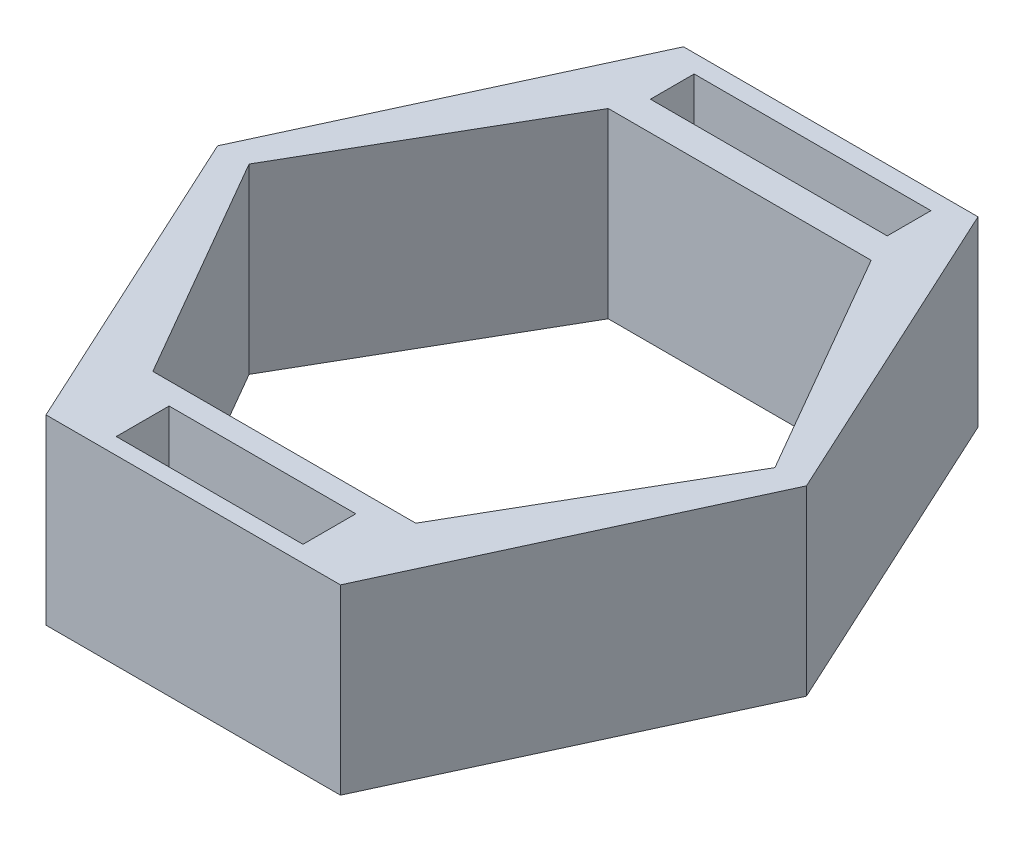
ISO-10303-21;
HEADER;
FILE_DESCRIPTION(('STEP AP214'),'2;1');
FILE_NAME('part.step','',(''),(''),'','','');
FILE_SCHEMA(('AUTOMOTIVE_DESIGN { 1 0 10303 214 1 1 1 1 }'));
ENDSEC;
DATA;
#1=APPLICATION_CONTEXT('core data for automotive mechanical design processes');
#2=APPLICATION_PROTOCOL_DEFINITION('international standard','automotive_design',2000,#1);
#3=PRODUCT_CONTEXT('',#1,'mechanical');
#4=PRODUCT('Part','Part','',(#3));
#5=PRODUCT_RELATED_PRODUCT_CATEGORY('part','',(#4));
#6=PRODUCT_DEFINITION_FORMATION('','',#4);
#7=PRODUCT_DEFINITION_CONTEXT('part definition',#1,'design');
#8=PRODUCT_DEFINITION('design','',#6,#7);
#9=PRODUCT_DEFINITION_SHAPE('','',#8);
#10=(LENGTH_UNIT() NAMED_UNIT(*) SI_UNIT(.MILLI.,.METRE.));
#11=(NAMED_UNIT(*) PLANE_ANGLE_UNIT() SI_UNIT($,.RADIAN.));
#12=(NAMED_UNIT(*) SI_UNIT($,.STERADIAN.) SOLID_ANGLE_UNIT());
#13=UNCERTAINTY_MEASURE_WITH_UNIT(LENGTH_MEASURE(1.E-05),#10,'distance_accuracy_value','');
#14=(GEOMETRIC_REPRESENTATION_CONTEXT(3) GLOBAL_UNCERTAINTY_ASSIGNED_CONTEXT((#13)) GLOBAL_UNIT_ASSIGNED_CONTEXT((#10,
#11,#12)) REPRESENTATION_CONTEXT('',''));
#15=CARTESIAN_POINT('',(0.,0.,0.));
#16=DIRECTION('',(0.,0.,1.));
#17=DIRECTION('',(1.,0.,0.));
#18=AXIS2_PLACEMENT_3D('',#15,#16,#17);
#19=CARTESIAN_POINT('',(0.,20.,0.));
#20=DIRECTION('',(0.,1.,0.));
#21=DIRECTION('',(0.,0.,1.));
#22=AXIS2_PLACEMENT_3D('',#19,#20,#21);
#23=PLANE('',#22);
#24=DIRECTION('',(1.,0.,0.));
#25=VECTOR('',#24,1.);
#26=CARTESIAN_POINT('',(0.,20.,35.));
#27=LINE('',#26,#25);
#28=CARTESIAN_POINT('',(-16.1658075373095,20.,35.));
#29=VERTEX_POINT('',#28);
#30=CARTESIAN_POINT('',(16.1658075373095,20.,35.));
#31=VERTEX_POINT('',#30);
#32=EDGE_CURVE('E237',#29,#31,#27,.T.);
#33=ORIENTED_EDGE('',*,*,#32,.T.);
#34=DIRECTION('',(0.419313934688772,0.,-0.907841299003201));
#35=VECTOR('',#34,1.);
#36=CARTESIAN_POINT('',(26.6469355010597,20.,12.3076923076925));
#37=LINE('',#36,#35);
#38=CARTESIAN_POINT('',(32.3316150746192,20.,1.66533453693773E-13));
#39=VERTEX_POINT('',#38);
#40=EDGE_CURVE('E240',#31,#39,#37,.T.);
#41=ORIENTED_EDGE('',*,*,#40,.T.);
#42=DIRECTION('',(0.419313934688769,0.,0.907841299003203));
#43=VECTOR('',#42,1.);
#44=CARTESIAN_POINT('',(26.6469355010596,20.,-12.3076923076924));
#45=LINE('',#44,#43);
#46=CARTESIAN_POINT('',(16.1658075373095,20.,-35.));
#47=VERTEX_POINT('',#46);
#48=EDGE_CURVE('E243',#47,#39,#45,.T.);
#49=ORIENTED_EDGE('',*,*,#48,.F.);
#50=DIRECTION('',(1.,0.,0.));
#51=VECTOR('',#50,1.);
#52=CARTESIAN_POINT('',(0.,20.,-35.));
#53=LINE('',#52,#51);
#54=CARTESIAN_POINT('',(-16.1658075373095,20.,-35.));
#55=VERTEX_POINT('',#54);
#56=EDGE_CURVE('E246',#55,#47,#53,.T.);
#57=ORIENTED_EDGE('',*,*,#56,.F.);
#58=DIRECTION('',(-0.41931393468877,0.,0.907841299003202));
#59=VECTOR('',#58,1.);
#60=CARTESIAN_POINT('',(-26.6469355010596,20.,-12.3076923076924));
#61=LINE('',#60,#59);
#62=CARTESIAN_POINT('',(-32.3316150746192,20.,0.));
#63=VERTEX_POINT('',#62);
#64=EDGE_CURVE('E249',#55,#63,#61,.T.);
#65=ORIENTED_EDGE('',*,*,#64,.T.);
#66=DIRECTION('',(-0.419313934688771,0.,-0.907841299003202));
#67=VECTOR('',#66,1.);
#68=CARTESIAN_POINT('',(-26.6469355010596,20.,12.3076923076924));
#69=LINE('',#68,#67);
#70=EDGE_CURVE('E251',#29,#63,#69,.T.);
#71=ORIENTED_EDGE('',*,*,#70,.F.);
#72=EDGE_LOOP('',(#33,#41,#49,#57,#65,#71));
#73=FACE_BOUND('',#72,.T.);
#74=DIRECTION('',(0.499999999999995,0.,-0.866025403784441));
#75=VECTOR('',#74,1.);
#76=CARTESIAN_POINT('',(21.6506350946111,20.,12.4999999999999));
#77=LINE('',#76,#75);
#78=CARTESIAN_POINT('',(14.4337567297409,20.,24.9999999999999));
#79=VERTEX_POINT('',#78);
#80=CARTESIAN_POINT('',(28.8675134594813,20.,0.));
#81=VERTEX_POINT('',#80);
#82=EDGE_CURVE('E254',#79,#81,#77,.T.);
#83=ORIENTED_EDGE('',*,*,#82,.F.);
#84=DIRECTION('',(1.,0.,0.));
#85=VECTOR('',#84,1.);
#86=CARTESIAN_POINT('',(2.61402740180265E-13,20.,25.));
#87=LINE('',#86,#85);
#88=CARTESIAN_POINT('',(-14.4337567297404,20.,25.0000000000002));
#89=VERTEX_POINT('',#88);
#90=EDGE_CURVE('E257',#89,#79,#87,.T.);
#91=ORIENTED_EDGE('',*,*,#90,.F.);
#92=DIRECTION('',(0.500000000000007,0.,0.866025403784435));
#93=VECTOR('',#92,1.);
#94=CARTESIAN_POINT('',(-21.6506350946109,20.,12.5000000000002));
#95=LINE('',#94,#93);
#96=CARTESIAN_POINT('',(-28.8675134594813,20.,2.0122792321331E-13));
#97=VERTEX_POINT('',#96);
#98=EDGE_CURVE('E260',#97,#89,#95,.T.);
#99=ORIENTED_EDGE('',*,*,#98,.F.);
#100=DIRECTION('',(-0.499999999999995,0.,0.866025403784442));
#101=VECTOR('',#100,1.);
#102=CARTESIAN_POINT('',(-21.650635094611,20.,-12.4999999999999));
#103=LINE('',#102,#101);
#104=CARTESIAN_POINT('',(-14.4337567297408,20.,-25.));
#105=VERTEX_POINT('',#104);
#106=EDGE_CURVE('E263',#105,#97,#103,.T.);
#107=ORIENTED_EDGE('',*,*,#106,.F.);
#108=DIRECTION('',(-1.,0.,0.));
#109=VECTOR('',#108,1.);
#110=CARTESIAN_POINT('',(0.,20.,-25.));
#111=LINE('',#110,#109);
#112=CARTESIAN_POINT('',(14.4337567297406,20.,-25.));
#113=VERTEX_POINT('',#112);
#114=EDGE_CURVE('E266',#113,#105,#111,.T.);
#115=ORIENTED_EDGE('',*,*,#114,.F.);
#116=DIRECTION('',(-0.500000000000001,0.,-0.866025403784438));
#117=VECTOR('',#116,1.);
#118=CARTESIAN_POINT('',(21.650635094611,20.,-12.5));
#119=LINE('',#118,#117);
#120=EDGE_CURVE('E269',#81,#113,#119,.T.);
#121=ORIENTED_EDGE('',*,*,#120,.F.);
#122=EDGE_LOOP('',(#83,#91,#99,#107,#115,#121));
#123=FACE_BOUND('',#122,.T.);
#124=DIRECTION('',(1.,0.,0.));
#125=VECTOR('',#124,1.);
#126=CARTESIAN_POINT('',(0.,20.,27.4000000000002));
#127=LINE('',#126,#125);
#128=CARTESIAN_POINT('',(-10.25,20.,27.4000000000002));
#129=VERTEX_POINT('',#128);
#130=CARTESIAN_POINT('',(10.25,20.,27.4000000000002));
#131=VERTEX_POINT('',#130);
#132=EDGE_CURVE('E220',#129,#131,#127,.T.);
#133=ORIENTED_EDGE('',*,*,#132,.T.);
#134=DIRECTION('',(0.,0.,1.));
#135=VECTOR('',#134,1.);
#136=CARTESIAN_POINT('',(10.25,20.,0.));
#137=LINE('',#136,#135);
#138=CARTESIAN_POINT('',(10.25,20.,33.2000000000002));
#139=VERTEX_POINT('',#138);
#140=EDGE_CURVE('E203',#131,#139,#137,.T.);
#141=ORIENTED_EDGE('',*,*,#140,.T.);
#142=DIRECTION('',(1.,0.,0.));
#143=VECTOR('',#142,1.);
#144=CARTESIAN_POINT('',(0.,20.,33.2000000000001));
#145=LINE('',#144,#143);
#146=CARTESIAN_POINT('',(-10.25,20.,33.2000000000001));
#147=VERTEX_POINT('',#146);
#148=EDGE_CURVE('E209',#147,#139,#145,.T.);
#149=ORIENTED_EDGE('',*,*,#148,.F.);
#150=DIRECTION('',(0.,0.,1.));
#151=VECTOR('',#150,1.);
#152=CARTESIAN_POINT('',(-10.25,20.,0.));
#153=LINE('',#152,#151);
#154=EDGE_CURVE('E223',#129,#147,#153,.T.);
#155=ORIENTED_EDGE('',*,*,#154,.F.);
#156=EDGE_LOOP('',(#133,#141,#149,#155));
#157=FACE_BOUND('',#156,.T.);
#158=DIRECTION('',(1.,0.,0.));
#159=VECTOR('',#158,1.);
#160=CARTESIAN_POINT('',(0.,20.,-33.));
#161=LINE('',#160,#159);
#162=CARTESIAN_POINT('',(-13.,20.,-33.));
#163=VERTEX_POINT('',#162);
#164=CARTESIAN_POINT('',(13.,20.,-33.));
#165=VERTEX_POINT('',#164);
#166=EDGE_CURVE('E191',#163,#165,#161,.T.);
#167=ORIENTED_EDGE('',*,*,#166,.T.);
#168=DIRECTION('',(0.,0.,1.));
#169=VECTOR('',#168,1.);
#170=CARTESIAN_POINT('',(13.,20.,0.));
#171=LINE('',#170,#169);
#172=CARTESIAN_POINT('',(13.,20.,-28.2));
#173=VERTEX_POINT('',#172);
#174=EDGE_CURVE('E58',#165,#173,#171,.T.);
#175=ORIENTED_EDGE('',*,*,#174,.T.);
#176=DIRECTION('',(1.,0.,0.));
#177=VECTOR('',#176,1.);
#178=CARTESIAN_POINT('',(0.,20.,-28.2));
#179=LINE('',#178,#177);
#180=CARTESIAN_POINT('',(-13.,20.,-28.2));
#181=VERTEX_POINT('',#180);
#182=EDGE_CURVE('E196',#181,#173,#179,.T.);
#183=ORIENTED_EDGE('',*,*,#182,.F.);
#184=DIRECTION('',(0.,0.,1.));
#185=VECTOR('',#184,1.);
#186=CARTESIAN_POINT('',(-13.,20.,0.));
#187=LINE('',#186,#185);
#188=EDGE_CURVE('E182',#163,#181,#187,.T.);
#189=ORIENTED_EDGE('',*,*,#188,.F.);
#190=EDGE_LOOP('',(#167,#175,#183,#189));
#191=FACE_BOUND('',#190,.T.);
#192=ADVANCED_FACE('F43',(#73,#123,#157,#191),#23,.T.);
#193=CARTESIAN_POINT('',(0.,0.,0.));
#194=DIRECTION('',(0.,1.,0.));
#195=DIRECTION('',(0.,0.,1.));
#196=AXIS2_PLACEMENT_3D('',#193,#194,#195);
#197=PLANE('',#196);
#198=DIRECTION('',(0.499999999999995,0.,-0.866025403784441));
#199=VECTOR('',#198,1.);
#200=CARTESIAN_POINT('',(21.6506350946111,0.,12.4999999999999));
#201=LINE('',#200,#199);
#202=CARTESIAN_POINT('',(14.4337567297409,0.,24.9999999999999));
#203=VERTEX_POINT('',#202);
#204=CARTESIAN_POINT('',(28.8675134594813,0.,0.));
#205=VERTEX_POINT('',#204);
#206=EDGE_CURVE('E290',#203,#205,#201,.T.);
#207=ORIENTED_EDGE('',*,*,#206,.T.);
#208=DIRECTION('',(-0.500000000000001,0.,-0.866025403784438));
#209=VECTOR('',#208,1.);
#210=CARTESIAN_POINT('',(21.650635094611,0.,-12.5));
#211=LINE('',#210,#209);
#212=CARTESIAN_POINT('',(14.4337567297406,0.,-25.));
#213=VERTEX_POINT('',#212);
#214=EDGE_CURVE('E241',#205,#213,#211,.T.);
#215=ORIENTED_EDGE('',*,*,#214,.T.);
#216=DIRECTION('',(-1.,0.,0.));
#217=VECTOR('',#216,1.);
#218=CARTESIAN_POINT('',(0.,0.,-25.));
#219=LINE('',#218,#217);
#220=CARTESIAN_POINT('',(-14.4337567297408,0.,-25.));
#221=VERTEX_POINT('',#220);
#222=EDGE_CURVE('E302',#213,#221,#219,.T.);
#223=ORIENTED_EDGE('',*,*,#222,.T.);
#224=DIRECTION('',(-0.499999999999995,0.,0.866025403784442));
#225=VECTOR('',#224,1.);
#226=CARTESIAN_POINT('',(-21.650635094611,0.,-12.4999999999999));
#227=LINE('',#226,#225);
#228=CARTESIAN_POINT('',(-28.8675134594813,0.,2.0122792321331E-13));
#229=VERTEX_POINT('',#228);
#230=EDGE_CURVE('E299',#221,#229,#227,.T.);
#231=ORIENTED_EDGE('',*,*,#230,.T.);
#232=DIRECTION('',(0.500000000000007,0.,0.866025403784435));
#233=VECTOR('',#232,1.);
#234=CARTESIAN_POINT('',(-21.6506350946109,0.,12.5000000000002));
#235=LINE('',#234,#233);
#236=CARTESIAN_POINT('',(-14.4337567297404,0.,25.0000000000002));
#237=VERTEX_POINT('',#236);
#238=EDGE_CURVE('E296',#229,#237,#235,.T.);
#239=ORIENTED_EDGE('',*,*,#238,.T.);
#240=DIRECTION('',(1.,0.,0.));
#241=VECTOR('',#240,1.);
#242=CARTESIAN_POINT('',(2.61402740180265E-13,0.,25.));
#243=LINE('',#242,#241);
#244=EDGE_CURVE('E293',#237,#203,#243,.T.);
#245=ORIENTED_EDGE('',*,*,#244,.T.);
#246=EDGE_LOOP('',(#207,#215,#223,#231,#239,#245));
#247=FACE_BOUND('',#246,.T.);
#248=DIRECTION('',(1.,0.,0.));
#249=VECTOR('',#248,1.);
#250=CARTESIAN_POINT('',(0.,0.,35.));
#251=LINE('',#250,#249);
#252=CARTESIAN_POINT('',(-16.1658075373095,0.,35.));
#253=VERTEX_POINT('',#252);
#254=CARTESIAN_POINT('',(16.1658075373095,0.,35.));
#255=VERTEX_POINT('',#254);
#256=EDGE_CURVE('E230',#253,#255,#251,.T.);
#257=ORIENTED_EDGE('',*,*,#256,.F.);
#258=DIRECTION('',(-0.419313934688771,0.,-0.907841299003202));
#259=VECTOR('',#258,1.);
#260=CARTESIAN_POINT('',(-26.6469355010596,0.,12.3076923076924));
#261=LINE('',#260,#259);
#262=CARTESIAN_POINT('',(-32.3316150746192,0.,0.));
#263=VERTEX_POINT('',#262);
#264=EDGE_CURVE('E287',#253,#263,#261,.T.);
#265=ORIENTED_EDGE('',*,*,#264,.T.);
#266=DIRECTION('',(-0.41931393468877,0.,0.907841299003202));
#267=VECTOR('',#266,1.);
#268=CARTESIAN_POINT('',(-26.6469355010596,0.,-12.3076923076924));
#269=LINE('',#268,#267);
#270=CARTESIAN_POINT('',(-16.1658075373095,0.,-35.));
#271=VERTEX_POINT('',#270);
#272=EDGE_CURVE('E284',#271,#263,#269,.T.);
#273=ORIENTED_EDGE('',*,*,#272,.F.);
#274=DIRECTION('',(1.,0.,0.));
#275=VECTOR('',#274,1.);
#276=CARTESIAN_POINT('',(0.,0.,-35.));
#277=LINE('',#276,#275);
#278=CARTESIAN_POINT('',(16.1658075373095,0.,-35.));
#279=VERTEX_POINT('',#278);
#280=EDGE_CURVE('E281',#271,#279,#277,.T.);
#281=ORIENTED_EDGE('',*,*,#280,.T.);
#282=DIRECTION('',(0.419313934688769,0.,0.907841299003203));
#283=VECTOR('',#282,1.);
#284=CARTESIAN_POINT('',(26.6469355010596,0.,-12.3076923076924));
#285=LINE('',#284,#283);
#286=CARTESIAN_POINT('',(32.3316150746192,0.,1.66533453693773E-13));
#287=VERTEX_POINT('',#286);
#288=EDGE_CURVE('E278',#279,#287,#285,.T.);
#289=ORIENTED_EDGE('',*,*,#288,.T.);
#290=DIRECTION('',(0.419313934688772,0.,-0.907841299003201));
#291=VECTOR('',#290,1.);
#292=CARTESIAN_POINT('',(26.6469355010597,0.,12.3076923076925));
#293=LINE('',#292,#291);
#294=EDGE_CURVE('E275',#255,#287,#293,.T.);
#295=ORIENTED_EDGE('',*,*,#294,.F.);
#296=EDGE_LOOP('',(#257,#265,#273,#281,#289,#295));
#297=FACE_BOUND('',#296,.T.);
#298=DIRECTION('',(0.,0.,1.));
#299=VECTOR('',#298,1.);
#300=CARTESIAN_POINT('',(13.,0.,0.));
#301=LINE('',#300,#299);
#302=CARTESIAN_POINT('',(13.,0.,-33.));
#303=VERTEX_POINT('',#302);
#304=CARTESIAN_POINT('',(13.,0.,-28.2));
#305=VERTEX_POINT('',#304);
#306=EDGE_CURVE('E11',#303,#305,#301,.T.);
#307=ORIENTED_EDGE('',*,*,#306,.F.);
#308=DIRECTION('',(1.,0.,0.));
#309=VECTOR('',#308,1.);
#310=CARTESIAN_POINT('',(0.,0.,-33.));
#311=LINE('',#310,#309);
#312=CARTESIAN_POINT('',(-13.,0.,-33.));
#313=VERTEX_POINT('',#312);
#314=EDGE_CURVE('E320',#313,#303,#311,.T.);
#315=ORIENTED_EDGE('',*,*,#314,.F.);
#316=DIRECTION('',(0.,0.,1.));
#317=VECTOR('',#316,1.);
#318=CARTESIAN_POINT('',(-13.,0.,0.));
#319=LINE('',#318,#317);
#320=CARTESIAN_POINT('',(-13.,0.,-28.2));
#321=VERTEX_POINT('',#320);
#322=EDGE_CURVE('E185',#313,#321,#319,.T.);
#323=ORIENTED_EDGE('',*,*,#322,.T.);
#324=DIRECTION('',(1.,0.,0.));
#325=VECTOR('',#324,1.);
#326=CARTESIAN_POINT('',(0.,0.,-28.2));
#327=LINE('',#326,#325);
#328=EDGE_CURVE('E51',#321,#305,#327,.T.);
#329=ORIENTED_EDGE('',*,*,#328,.T.);
#330=EDGE_LOOP('',(#307,#315,#323,#329));
#331=FACE_BOUND('',#330,.T.);
#332=ADVANCED_FACE('F336',(#247,#297,#331),#197,.F.);
#333=CARTESIAN_POINT('',(21.6506350946111,20.,12.4999999999999));
#334=DIRECTION('',(-0.866025403784441,0.,-0.499999999999995));
#335=DIRECTION('',(-0.499999999999995,0.,0.866025403784441));
#336=AXIS2_PLACEMENT_3D('',#333,#334,#335);
#337=PLANE('',#336);
#338=ORIENTED_EDGE('',*,*,#206,.F.);
#339=DIRECTION('',(0.,-1.,0.));
#340=VECTOR('',#339,1.);
#341=CARTESIAN_POINT('',(14.4337567297409,20.,24.9999999999999));
#342=LINE('',#341,#340);
#343=EDGE_CURVE('E318',#79,#203,#342,.T.);
#344=ORIENTED_EDGE('',*,*,#343,.F.);
#345=ORIENTED_EDGE('',*,*,#82,.T.);
#346=DIRECTION('',(0.,-1.,0.));
#347=VECTOR('',#346,1.);
#348=CARTESIAN_POINT('',(28.8675134594813,20.,0.));
#349=LINE('',#348,#347);
#350=EDGE_CURVE('E307',#81,#205,#349,.T.);
#351=ORIENTED_EDGE('',*,*,#350,.T.);
#352=EDGE_LOOP('',(#338,#344,#345,#351));
#353=FACE_BOUND('',#352,.T.);
#354=ADVANCED_FACE('F359',(#353),#337,.T.);
#355=CARTESIAN_POINT('',(2.61402740180265E-13,20.,25.));
#356=DIRECTION('',(0.,0.,-1.));
#357=DIRECTION('',(-1.,0.,0.));
#358=AXIS2_PLACEMENT_3D('',#355,#356,#357);
#359=PLANE('',#358);
#360=ORIENTED_EDGE('',*,*,#244,.F.);
#361=DIRECTION('',(0.,-1.,0.));
#362=VECTOR('',#361,1.);
#363=CARTESIAN_POINT('',(-14.4337567297404,20.,25.0000000000002));
#364=LINE('',#363,#362);
#365=EDGE_CURVE('E316',#89,#237,#364,.T.);
#366=ORIENTED_EDGE('',*,*,#365,.F.);
#367=ORIENTED_EDGE('',*,*,#90,.T.);
#368=ORIENTED_EDGE('',*,*,#343,.T.);
#369=EDGE_LOOP('',(#360,#366,#367,#368));
#370=FACE_BOUND('',#369,.T.);
#371=ADVANCED_FACE('F383',(#370),#359,.T.);
#372=CARTESIAN_POINT('',(-21.6506350946109,20.,12.5000000000002));
#373=DIRECTION('',(0.866025403784434,0.,-0.500000000000007));
#374=DIRECTION('',(-0.500000000000007,0.,-0.866025403784435));
#375=AXIS2_PLACEMENT_3D('',#372,#373,#374);
#376=PLANE('',#375);
#377=ORIENTED_EDGE('',*,*,#238,.F.);
#378=DIRECTION('',(0.,-1.,0.));
#379=VECTOR('',#378,1.);
#380=CARTESIAN_POINT('',(-28.8675134594813,20.,2.0122792321331E-13));
#381=LINE('',#380,#379);
#382=EDGE_CURVE('E314',#97,#229,#381,.T.);
#383=ORIENTED_EDGE('',*,*,#382,.F.);
#384=ORIENTED_EDGE('',*,*,#98,.T.);
#385=ORIENTED_EDGE('',*,*,#365,.T.);
#386=EDGE_LOOP('',(#377,#383,#384,#385));
#387=FACE_BOUND('',#386,.T.);
#388=ADVANCED_FACE('F379',(#387),#376,.T.);
#389=CARTESIAN_POINT('',(-21.650635094611,20.,-12.4999999999999));
#390=DIRECTION('',(0.866025403784442,0.,0.499999999999995));
#391=DIRECTION('',(0.499999999999995,0.,-0.866025403784442));
#392=AXIS2_PLACEMENT_3D('',#389,#390,#391);
#393=PLANE('',#392);
#394=ORIENTED_EDGE('',*,*,#230,.F.);
#395=DIRECTION('',(0.,-1.,0.));
#396=VECTOR('',#395,1.);
#397=CARTESIAN_POINT('',(-14.4337567297408,20.,-25.));
#398=LINE('',#397,#396);
#399=EDGE_CURVE('E312',#105,#221,#398,.T.);
#400=ORIENTED_EDGE('',*,*,#399,.F.);
#401=ORIENTED_EDGE('',*,*,#106,.T.);
#402=ORIENTED_EDGE('',*,*,#382,.T.);
#403=EDGE_LOOP('',(#394,#400,#401,#402));
#404=FACE_BOUND('',#403,.T.);
#405=ADVANCED_FACE('F375',(#404),#393,.T.);
#406=CARTESIAN_POINT('',(0.,20.,-25.));
#407=DIRECTION('',(0.,0.,1.));
#408=DIRECTION('',(1.,0.,0.));
#409=AXIS2_PLACEMENT_3D('',#406,#407,#408);
#410=PLANE('',#409);
#411=ORIENTED_EDGE('',*,*,#222,.F.);
#412=DIRECTION('',(0.,-1.,0.));
#413=VECTOR('',#412,1.);
#414=CARTESIAN_POINT('',(14.4337567297406,20.,-25.));
#415=LINE('',#414,#413);
#416=EDGE_CURVE('E309',#113,#213,#415,.T.);
#417=ORIENTED_EDGE('',*,*,#416,.F.);
#418=ORIENTED_EDGE('',*,*,#114,.T.);
#419=ORIENTED_EDGE('',*,*,#399,.T.);
#420=EDGE_LOOP('',(#411,#417,#418,#419));
#421=FACE_BOUND('',#420,.T.);
#422=ADVANCED_FACE('F372',(#421),#410,.T.);
#423=CARTESIAN_POINT('',(0.,20.,35.));
#424=DIRECTION('',(0.,0.,-1.));
#425=DIRECTION('',(-1.,0.,0.));
#426=AXIS2_PLACEMENT_3D('',#423,#424,#425);
#427=PLANE('',#426);
#428=ORIENTED_EDGE('',*,*,#256,.T.);
#429=DIRECTION('',(0.,-1.,0.));
#430=VECTOR('',#429,1.);
#431=CARTESIAN_POINT('',(16.1658075373095,20.,35.));
#432=LINE('',#431,#430);
#433=EDGE_CURVE('E310',#31,#255,#432,.T.);
#434=ORIENTED_EDGE('',*,*,#433,.F.);
#435=ORIENTED_EDGE('',*,*,#32,.F.);
#436=DIRECTION('',(0.,-1.,0.));
#437=VECTOR('',#436,1.);
#438=CARTESIAN_POINT('',(-16.1658075373095,20.,35.));
#439=LINE('',#438,#437);
#440=EDGE_CURVE('E272',#29,#253,#439,.T.);
#441=ORIENTED_EDGE('',*,*,#440,.T.);
#442=EDGE_LOOP('',(#428,#434,#435,#441));
#443=FACE_BOUND('',#442,.T.);
#444=ADVANCED_FACE('F45',(#443),#427,.F.);
#445=CARTESIAN_POINT('',(26.6469355010597,20.,12.3076923076925));
#446=DIRECTION('',(-0.907841299003201,0.,-0.419313934688772));
#447=DIRECTION('',(-0.419313934688772,0.,0.907841299003201));
#448=AXIS2_PLACEMENT_3D('',#445,#446,#447);
#449=PLANE('',#448);
#450=ORIENTED_EDGE('',*,*,#294,.T.);
#451=DIRECTION('',(0.,-1.,0.));
#452=VECTOR('',#451,1.);
#453=CARTESIAN_POINT('',(32.3316150746192,20.,1.66533453693773E-13));
#454=LINE('',#453,#452);
#455=EDGE_CURVE('E328',#39,#287,#454,.T.);
#456=ORIENTED_EDGE('',*,*,#455,.F.);
#457=ORIENTED_EDGE('',*,*,#40,.F.);
#458=ORIENTED_EDGE('',*,*,#433,.T.);
#459=EDGE_LOOP('',(#450,#456,#457,#458));
#460=FACE_BOUND('',#459,.T.);
#461=ADVANCED_FACE('F404',(#460),#449,.F.);
#462=CARTESIAN_POINT('',(26.6469355010596,20.,-12.3076923076924));
#463=DIRECTION('',(0.907841299003203,0.,-0.419313934688769));
#464=DIRECTION('',(-0.419313934688769,0.,-0.907841299003203));
#465=AXIS2_PLACEMENT_3D('',#462,#463,#464);
#466=PLANE('',#465);
#467=ORIENTED_EDGE('',*,*,#288,.F.);
#468=DIRECTION('',(0.,-1.,0.));
#469=VECTOR('',#468,1.);
#470=CARTESIAN_POINT('',(16.1658075373095,20.,-35.));
#471=LINE('',#470,#469);
#472=EDGE_CURVE('E326',#47,#279,#471,.T.);
#473=ORIENTED_EDGE('',*,*,#472,.F.);
#474=ORIENTED_EDGE('',*,*,#48,.T.);
#475=ORIENTED_EDGE('',*,*,#455,.T.);
#476=EDGE_LOOP('',(#467,#473,#474,#475));
#477=FACE_BOUND('',#476,.T.);
#478=ADVANCED_FACE('F401',(#477),#466,.T.);
#479=CARTESIAN_POINT('',(0.,20.,-35.));
#480=DIRECTION('',(0.,0.,-1.));
#481=DIRECTION('',(-1.,0.,0.));
#482=AXIS2_PLACEMENT_3D('',#479,#480,#481);
#483=PLANE('',#482);
#484=ORIENTED_EDGE('',*,*,#280,.F.);
#485=DIRECTION('',(0.,-1.,0.));
#486=VECTOR('',#485,1.);
#487=CARTESIAN_POINT('',(-16.1658075373095,20.,-35.));
#488=LINE('',#487,#486);
#489=EDGE_CURVE('E324',#55,#271,#488,.T.);
#490=ORIENTED_EDGE('',*,*,#489,.F.);
#491=ORIENTED_EDGE('',*,*,#56,.T.);
#492=ORIENTED_EDGE('',*,*,#472,.T.);
#493=EDGE_LOOP('',(#484,#490,#491,#492));
#494=FACE_BOUND('',#493,.T.);
#495=ADVANCED_FACE('F397',(#494),#483,.T.);
#496=CARTESIAN_POINT('',(-26.6469355010596,20.,-12.3076923076924));
#497=DIRECTION('',(0.907841299003202,0.,0.41931393468877));
#498=DIRECTION('',(0.41931393468877,0.,-0.907841299003202));
#499=AXIS2_PLACEMENT_3D('',#496,#497,#498);
#500=PLANE('',#499);
#501=ORIENTED_EDGE('',*,*,#272,.T.);
#502=DIRECTION('',(0.,-1.,0.));
#503=VECTOR('',#502,1.);
#504=CARTESIAN_POINT('',(-32.3316150746192,20.,0.));
#505=LINE('',#504,#503);
#506=EDGE_CURVE('E322',#63,#263,#505,.T.);
#507=ORIENTED_EDGE('',*,*,#506,.F.);
#508=ORIENTED_EDGE('',*,*,#64,.F.);
#509=ORIENTED_EDGE('',*,*,#489,.T.);
#510=EDGE_LOOP('',(#501,#507,#508,#509));
#511=FACE_BOUND('',#510,.T.);
#512=ADVANCED_FACE('F393',(#511),#500,.F.);
#513=CARTESIAN_POINT('',(-26.6469355010596,20.,12.3076923076924));
#514=DIRECTION('',(-0.907841299003202,0.,0.419313934688771));
#515=DIRECTION('',(0.419313934688771,0.,0.907841299003202));
#516=AXIS2_PLACEMENT_3D('',#513,#514,#515);
#517=PLANE('',#516);
#518=ORIENTED_EDGE('',*,*,#264,.F.);
#519=ORIENTED_EDGE('',*,*,#440,.F.);
#520=ORIENTED_EDGE('',*,*,#70,.T.);
#521=ORIENTED_EDGE('',*,*,#506,.T.);
#522=EDGE_LOOP('',(#518,#519,#520,#521));
#523=FACE_BOUND('',#522,.T.);
#524=ADVANCED_FACE('F370',(#523),#517,.T.);
#525=CARTESIAN_POINT('',(21.650635094611,20.,-12.5));
#526=DIRECTION('',(-0.866025403784438,0.,0.500000000000001));
#527=DIRECTION('',(0.500000000000001,0.,0.866025403784438));
#528=AXIS2_PLACEMENT_3D('',#525,#526,#527);
#529=PLANE('',#528);
#530=ORIENTED_EDGE('',*,*,#214,.F.);
#531=ORIENTED_EDGE('',*,*,#350,.F.);
#532=ORIENTED_EDGE('',*,*,#120,.T.);
#533=ORIENTED_EDGE('',*,*,#416,.T.);
#534=EDGE_LOOP('',(#530,#531,#532,#533));
#535=FACE_BOUND('',#534,.T.);
#536=ADVANCED_FACE('F367',(#535),#529,.T.);
#537=CARTESIAN_POINT('',(10.25,3.,0.));
#538=DIRECTION('',(-1.,0.,0.));
#539=DIRECTION('',(0.,0.,1.));
#540=AXIS2_PLACEMENT_3D('',#537,#538,#539);
#541=PLANE('',#540);
#542=ORIENTED_EDGE('',*,*,#140,.F.);
#543=DIRECTION('',(0.,1.,0.));
#544=VECTOR('',#543,1.);
#545=CARTESIAN_POINT('',(10.25,3.,27.4000000000002));
#546=LINE('',#545,#544);
#547=CARTESIAN_POINT('',(10.25,3.,27.4000000000002));
#548=VERTEX_POINT('',#547);
#549=EDGE_CURVE('E217',#548,#131,#546,.T.);
#550=ORIENTED_EDGE('',*,*,#549,.F.);
#551=DIRECTION('',(0.,0.,1.));
#552=VECTOR('',#551,1.);
#553=CARTESIAN_POINT('',(10.25,3.,0.));
#554=LINE('',#553,#552);
#555=CARTESIAN_POINT('',(10.25,3.,33.2000000000002));
#556=VERTEX_POINT('',#555);
#557=EDGE_CURVE('E206',#548,#556,#554,.T.);
#558=ORIENTED_EDGE('',*,*,#557,.T.);
#559=DIRECTION('',(0.,1.,0.));
#560=VECTOR('',#559,1.);
#561=CARTESIAN_POINT('',(10.25,3.,33.2000000000002));
#562=LINE('',#561,#560);
#563=EDGE_CURVE('E228',#556,#139,#562,.T.);
#564=ORIENTED_EDGE('',*,*,#563,.T.);
#565=EDGE_LOOP('',(#542,#550,#558,#564));
#566=FACE_BOUND('',#565,.T.);
#567=ADVANCED_FACE('F364',(#566),#541,.T.);
#568=CARTESIAN_POINT('',(0.,3.,33.2000000000001));
#569=DIRECTION('',(0.,0.,1.));
#570=DIRECTION('',(1.,0.,0.));
#571=AXIS2_PLACEMENT_3D('',#568,#569,#570);
#572=PLANE('',#571);
#573=ORIENTED_EDGE('',*,*,#148,.T.);
#574=ORIENTED_EDGE('',*,*,#563,.F.);
#575=DIRECTION('',(1.,0.,0.));
#576=VECTOR('',#575,1.);
#577=CARTESIAN_POINT('',(0.,3.,33.2000000000001));
#578=LINE('',#577,#576);
#579=CARTESIAN_POINT('',(-10.25,3.,33.2000000000001));
#580=VERTEX_POINT('',#579);
#581=EDGE_CURVE('E214',#580,#556,#578,.T.);
#582=ORIENTED_EDGE('',*,*,#581,.F.);
#583=DIRECTION('',(0.,1.,0.));
#584=VECTOR('',#583,1.);
#585=CARTESIAN_POINT('',(-10.25,3.,33.2000000000001));
#586=LINE('',#585,#584);
#587=EDGE_CURVE('E231',#580,#147,#586,.T.);
#588=ORIENTED_EDGE('',*,*,#587,.T.);
#589=EDGE_LOOP('',(#573,#574,#582,#588));
#590=FACE_BOUND('',#589,.T.);
#591=ADVANCED_FACE('F496',(#590),#572,.F.);
#592=CARTESIAN_POINT('',(-10.25,3.,0.));
#593=DIRECTION('',(-1.,0.,0.));
#594=DIRECTION('',(0.,0.,1.));
#595=AXIS2_PLACEMENT_3D('',#592,#593,#594);
#596=PLANE('',#595);
#597=ORIENTED_EDGE('',*,*,#154,.T.);
#598=ORIENTED_EDGE('',*,*,#587,.F.);
#599=DIRECTION('',(0.,0.,1.));
#600=VECTOR('',#599,1.);
#601=CARTESIAN_POINT('',(-10.25,3.,0.));
#602=LINE('',#601,#600);
#603=CARTESIAN_POINT('',(-10.25,3.,27.4000000000002));
#604=VERTEX_POINT('',#603);
#605=EDGE_CURVE('E211',#604,#580,#602,.T.);
#606=ORIENTED_EDGE('',*,*,#605,.F.);
#607=DIRECTION('',(0.,1.,0.));
#608=VECTOR('',#607,1.);
#609=CARTESIAN_POINT('',(-10.25,3.,27.4000000000002));
#610=LINE('',#609,#608);
#611=EDGE_CURVE('E233',#604,#129,#610,.T.);
#612=ORIENTED_EDGE('',*,*,#611,.T.);
#613=EDGE_LOOP('',(#597,#598,#606,#612));
#614=FACE_BOUND('',#613,.T.);
#615=ADVANCED_FACE('F504',(#614),#596,.F.);
#616=CARTESIAN_POINT('',(0.,3.,27.4000000000002));
#617=DIRECTION('',(0.,0.,1.));
#618=DIRECTION('',(1.,0.,0.));
#619=AXIS2_PLACEMENT_3D('',#616,#617,#618);
#620=PLANE('',#619);
#621=ORIENTED_EDGE('',*,*,#132,.F.);
#622=ORIENTED_EDGE('',*,*,#611,.F.);
#623=DIRECTION('',(1.,0.,0.));
#624=VECTOR('',#623,1.);
#625=CARTESIAN_POINT('',(0.,3.,27.4000000000002));
#626=LINE('',#625,#624);
#627=EDGE_CURVE('E208',#604,#548,#626,.T.);
#628=ORIENTED_EDGE('',*,*,#627,.T.);
#629=ORIENTED_EDGE('',*,*,#549,.T.);
#630=EDGE_LOOP('',(#621,#622,#628,#629));
#631=FACE_BOUND('',#630,.T.);
#632=ADVANCED_FACE('F350',(#631),#620,.T.);
#633=CARTESIAN_POINT('',(0.,3.,0.));
#634=DIRECTION('',(0.,1.,0.));
#635=DIRECTION('',(0.,0.,1.));
#636=AXIS2_PLACEMENT_3D('',#633,#634,#635);
#637=PLANE('',#636);
#638=ORIENTED_EDGE('',*,*,#557,.F.);
#639=ORIENTED_EDGE('',*,*,#627,.F.);
#640=ORIENTED_EDGE('',*,*,#605,.T.);
#641=ORIENTED_EDGE('',*,*,#581,.T.);
#642=EDGE_LOOP('',(#638,#639,#640,#641));
#643=FACE_BOUND('',#642,.T.);
#644=ADVANCED_FACE('F342',(#643),#637,.T.);
#645=CARTESIAN_POINT('',(13.,-6.,0.));
#646=DIRECTION('',(-1.,0.,0.));
#647=DIRECTION('',(0.,0.,1.));
#648=AXIS2_PLACEMENT_3D('',#645,#646,#647);
#649=PLANE('',#648);
#650=ORIENTED_EDGE('',*,*,#306,.T.);
#651=DIRECTION('',(0.,1.,0.));
#652=VECTOR('',#651,1.);
#653=CARTESIAN_POINT('',(13.,-6.,-28.2));
#654=LINE('',#653,#652);
#655=EDGE_CURVE('E201',#305,#173,#654,.T.);
#656=ORIENTED_EDGE('',*,*,#655,.T.);
#657=ORIENTED_EDGE('',*,*,#174,.F.);
#658=DIRECTION('',(0.,1.,0.));
#659=VECTOR('',#658,1.);
#660=CARTESIAN_POINT('',(13.,-6.,-33.));
#661=LINE('',#660,#659);
#662=EDGE_CURVE('E188',#303,#165,#661,.T.);
#663=ORIENTED_EDGE('',*,*,#662,.F.);
#664=EDGE_LOOP('',(#650,#656,#657,#663));
#665=FACE_BOUND('',#664,.T.);
#666=ADVANCED_FACE('F340',(#665),#649,.T.);
#667=CARTESIAN_POINT('',(0.,-6.,-28.2));
#668=DIRECTION('',(0.,0.,1.));
#669=DIRECTION('',(1.,0.,0.));
#670=AXIS2_PLACEMENT_3D('',#667,#668,#669);
#671=PLANE('',#670);
#672=DIRECTION('',(0.,1.,0.));
#673=VECTOR('',#672,1.);
#674=CARTESIAN_POINT('',(-13.,-6.,-28.2));
#675=LINE('',#674,#673);
#676=EDGE_CURVE('E187',#321,#181,#675,.T.);
#677=ORIENTED_EDGE('',*,*,#676,.T.);
#678=ORIENTED_EDGE('',*,*,#182,.T.);
#679=ORIENTED_EDGE('',*,*,#655,.F.);
#680=ORIENTED_EDGE('',*,*,#328,.F.);
#681=EDGE_LOOP('',(#677,#678,#679,#680));
#682=FACE_BOUND('',#681,.T.);
#683=ADVANCED_FACE('F339',(#682),#671,.F.);
#684=CARTESIAN_POINT('',(-13.,-6.,0.));
#685=DIRECTION('',(-1.,0.,0.));
#686=DIRECTION('',(0.,0.,1.));
#687=AXIS2_PLACEMENT_3D('',#684,#685,#686);
#688=PLANE('',#687);
#689=DIRECTION('',(0.,1.,0.));
#690=VECTOR('',#689,1.);
#691=CARTESIAN_POINT('',(-13.,-6.,-33.));
#692=LINE('',#691,#690);
#693=EDGE_CURVE('E66',#313,#163,#692,.T.);
#694=ORIENTED_EDGE('',*,*,#693,.T.);
#695=ORIENTED_EDGE('',*,*,#188,.T.);
#696=ORIENTED_EDGE('',*,*,#676,.F.);
#697=ORIENTED_EDGE('',*,*,#322,.F.);
#698=EDGE_LOOP('',(#694,#695,#696,#697));
#699=FACE_BOUND('',#698,.T.);
#700=ADVANCED_FACE('F179',(#699),#688,.F.);
#701=CARTESIAN_POINT('',(0.,-6.,-33.));
#702=DIRECTION('',(0.,0.,1.));
#703=DIRECTION('',(1.,0.,0.));
#704=AXIS2_PLACEMENT_3D('',#701,#702,#703);
#705=PLANE('',#704);
#706=ORIENTED_EDGE('',*,*,#314,.T.);
#707=ORIENTED_EDGE('',*,*,#662,.T.);
#708=ORIENTED_EDGE('',*,*,#166,.F.);
#709=ORIENTED_EDGE('',*,*,#693,.F.);
#710=EDGE_LOOP('',(#706,#707,#708,#709));
#711=FACE_BOUND('',#710,.T.);
#712=ADVANCED_FACE('F192',(#711),#705,.T.);
#713=CLOSED_SHELL('',(#192,#332,#354,#371,#388,#405,#422,#444,#461,#478,#495,#512,#524,#536,
#567,#591,#615,#632,#644,#666,#683,#700,#712));
#714=MANIFOLD_SOLID_BREP('B2',#713);
#715=ADVANCED_BREP_SHAPE_REPRESENTATION('',(#18,#714),#14);
#716=SHAPE_DEFINITION_REPRESENTATION(#9,#715);
ENDSEC;
END-ISO-10303-21;
